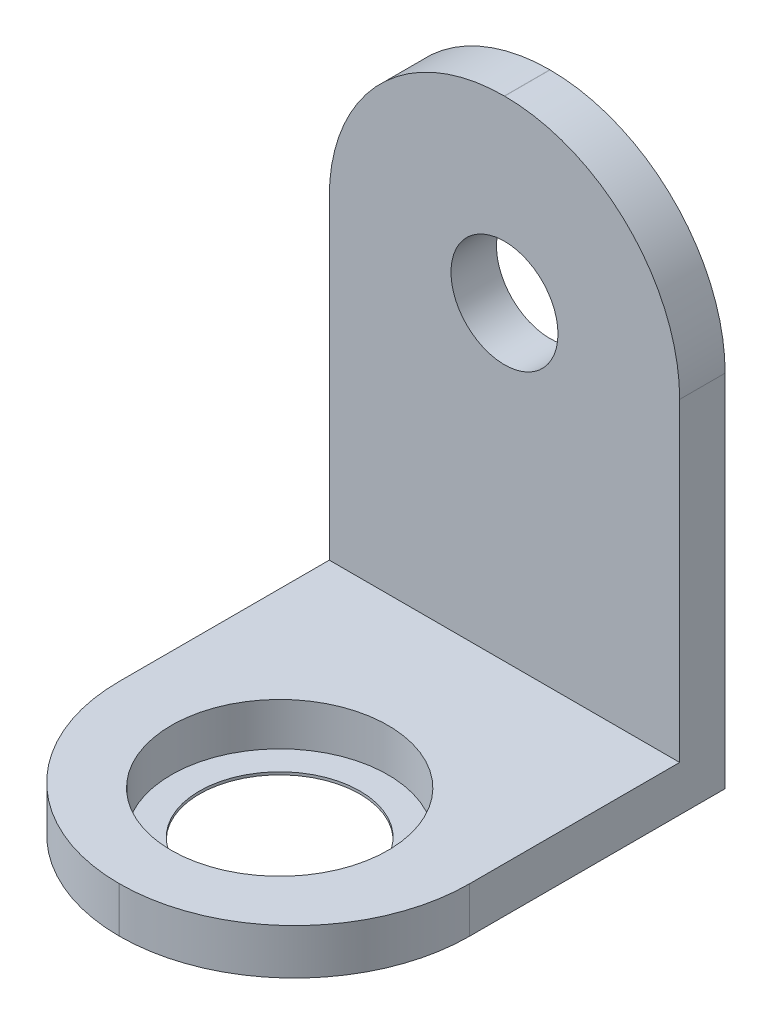
ISO-10303-21;
HEADER;
FILE_DESCRIPTION(('STEP AP214'),'2;1');
FILE_NAME('part.step','',(''),(''),'','','');
FILE_SCHEMA(('AUTOMOTIVE_DESIGN { 1 0 10303 214 1 1 1 1 }'));
ENDSEC;
DATA;
#1=APPLICATION_CONTEXT('core data for automotive mechanical design processes');
#2=APPLICATION_PROTOCOL_DEFINITION('international standard','automotive_design',2000,#1);
#3=PRODUCT_CONTEXT('',#1,'mechanical');
#4=PRODUCT('Part','Part','',(#3));
#5=PRODUCT_RELATED_PRODUCT_CATEGORY('part','',(#4));
#6=PRODUCT_DEFINITION_FORMATION('','',#4);
#7=PRODUCT_DEFINITION_CONTEXT('part definition',#1,'design');
#8=PRODUCT_DEFINITION('design','',#6,#7);
#9=PRODUCT_DEFINITION_SHAPE('','',#8);
#10=(LENGTH_UNIT() NAMED_UNIT(*) SI_UNIT(.MILLI.,.METRE.));
#11=(NAMED_UNIT(*) PLANE_ANGLE_UNIT() SI_UNIT($,.RADIAN.));
#12=(NAMED_UNIT(*) SI_UNIT($,.STERADIAN.) SOLID_ANGLE_UNIT());
#13=UNCERTAINTY_MEASURE_WITH_UNIT(LENGTH_MEASURE(1.E-05),#10,'distance_accuracy_value','');
#14=(GEOMETRIC_REPRESENTATION_CONTEXT(3) GLOBAL_UNCERTAINTY_ASSIGNED_CONTEXT((#13)) GLOBAL_UNIT_ASSIGNED_CONTEXT((#10,
#11,#12)) REPRESENTATION_CONTEXT('',''));
#15=CARTESIAN_POINT('',(0.,0.,0.));
#16=DIRECTION('',(0.,0.,1.));
#17=DIRECTION('',(1.,0.,0.));
#18=AXIS2_PLACEMENT_3D('',#15,#16,#17);
#19=CARTESIAN_POINT('',(0.0989682539682306,1.7,-0.445000000000001));
#20=DIRECTION('',(0.,-1.,0.));
#21=DIRECTION('',(0.,0.,-1.));
#22=AXIS2_PLACEMENT_3D('',#19,#20,#21);
#23=PLANE('',#22);
#24=CARTESIAN_POINT('',(0.,1.7,0.));
#25=DIRECTION('',(0.,1.,0.));
#26=DIRECTION('',(0.,0.,1.));
#27=AXIS2_PLACEMENT_3D('',#24,#25,#26);
#28=CIRCLE('',#27,4.05);
#29=CARTESIAN_POINT('',(0.,1.7,4.05));
#30=VERTEX_POINT('',#29);
#31=EDGE_CURVE('E279',#30,#30,#28,.T.);
#32=ORIENTED_EDGE('',*,*,#31,.F.);
#33=EDGE_LOOP('',(#32));
#34=FACE_BOUND('',#33,.T.);
#35=DIRECTION('',(1.,0.,0.));
#36=VECTOR('',#35,1.);
#37=CARTESIAN_POINT('',(-6.44603174603177,1.7,-8.3));
#38=LINE('',#37,#36);
#39=CARTESIAN_POINT('',(-6.44603174603177,1.7,-8.3));
#40=VERTEX_POINT('',#39);
#41=CARTESIAN_POINT('',(6.65396825396823,1.7,-8.3));
#42=VERTEX_POINT('',#41);
#43=EDGE_CURVE('E120',#40,#42,#38,.T.);
#44=ORIENTED_EDGE('',*,*,#43,.F.);
#45=DIRECTION('',(0.,0.,1.));
#46=VECTOR('',#45,1.);
#47=CARTESIAN_POINT('',(-6.44603174603177,1.7,-10.));
#48=LINE('',#47,#46);
#49=CARTESIAN_POINT('',(-6.44603174603177,1.7,-0.445000000000046));
#50=VERTEX_POINT('',#49);
#51=EDGE_CURVE('E140',#40,#50,#48,.T.);
#52=ORIENTED_EDGE('',*,*,#51,.T.);
#53=CARTESIAN_POINT('',(0.0989682539682306,1.7,-0.445000000000001));
#54=DIRECTION('',(0.,1.,0.));
#55=DIRECTION('',(0.,0.,-1.));
#56=AXIS2_PLACEMENT_3D('',#53,#54,#55);
#57=CIRCLE('',#56,6.545);
#58=CARTESIAN_POINT('',(0.0989682539682757,1.7,6.1));
#59=VERTEX_POINT('',#58);
#60=EDGE_CURVE('E142',#50,#59,#57,.T.);
#61=ORIENTED_EDGE('',*,*,#60,.T.);
#62=DIRECTION('',(1.,0.,0.));
#63=VECTOR('',#62,1.);
#64=CARTESIAN_POINT('',(0.0989682539682757,1.7,6.1));
#65=LINE('',#64,#63);
#66=CARTESIAN_POINT('',(0.108968253968186,1.7,6.1));
#67=VERTEX_POINT('',#66);
#68=EDGE_CURVE('E145',#59,#67,#65,.T.);
#69=ORIENTED_EDGE('',*,*,#68,.T.);
#70=CARTESIAN_POINT('',(0.108968253968232,1.7,-0.444999999999999));
#71=DIRECTION('',(0.,1.,0.));
#72=DIRECTION('',(0.,0.,-1.));
#73=AXIS2_PLACEMENT_3D('',#70,#71,#72);
#74=CIRCLE('',#73,6.545);
#75=CARTESIAN_POINT('',(6.65396825396823,1.7,-0.445000000000048));
#76=VERTEX_POINT('',#75);
#77=EDGE_CURVE('E123',#67,#76,#74,.T.);
#78=ORIENTED_EDGE('',*,*,#77,.T.);
#79=DIRECTION('',(0.,0.,-1.));
#80=VECTOR('',#79,1.);
#81=CARTESIAN_POINT('',(6.65396825396823,1.7,-10.));
#82=LINE('',#81,#80);
#83=EDGE_CURVE('E112',#76,#42,#82,.T.);
#84=ORIENTED_EDGE('',*,*,#83,.T.);
#85=EDGE_LOOP('',(#44,#52,#61,#69,#78,#84));
#86=FACE_BOUND('',#85,.T.);
#87=ADVANCED_FACE('F32',(#34,#86),#23,.F.);
#88=CARTESIAN_POINT('',(0.0989682539682306,0.,-0.445000000000001));
#89=DIRECTION('',(0.,-1.,0.));
#90=DIRECTION('',(0.,0.,-1.));
#91=AXIS2_PLACEMENT_3D('',#88,#89,#90);
#92=PLANE('',#91);
#93=CARTESIAN_POINT('',(0.,0.,0.));
#94=DIRECTION('',(0.,-1.,0.));
#95=DIRECTION('',(0.,0.,-1.));
#96=AXIS2_PLACEMENT_3D('',#93,#94,#95);
#97=CIRCLE('',#96,3.);
#98=CARTESIAN_POINT('',(0.,0.,-3.));
#99=VERTEX_POINT('',#98);
#100=EDGE_CURVE('E277',#99,#99,#97,.T.);
#101=ORIENTED_EDGE('',*,*,#100,.F.);
#102=EDGE_LOOP('',(#101));
#103=FACE_BOUND('',#102,.T.);
#104=DIRECTION('',(0.,0.,1.));
#105=VECTOR('',#104,1.);
#106=CARTESIAN_POINT('',(-6.44603174603177,0.,-10.));
#107=LINE('',#106,#105);
#108=CARTESIAN_POINT('',(-6.44603174603177,0.,-10.));
#109=VERTEX_POINT('',#108);
#110=CARTESIAN_POINT('',(-6.44603174603177,0.,-0.445000000000046));
#111=VERTEX_POINT('',#110);
#112=EDGE_CURVE('E139',#109,#111,#107,.T.);
#113=ORIENTED_EDGE('',*,*,#112,.F.);
#114=DIRECTION('',(-1.,0.,0.));
#115=VECTOR('',#114,1.);
#116=CARTESIAN_POINT('',(-6.44603174603177,0.,-10.));
#117=LINE('',#116,#115);
#118=CARTESIAN_POINT('',(6.65396825396823,0.,-10.));
#119=VERTEX_POINT('',#118);
#120=EDGE_CURVE('E143',#119,#109,#117,.T.);
#121=ORIENTED_EDGE('',*,*,#120,.F.);
#122=DIRECTION('',(0.,0.,-1.));
#123=VECTOR('',#122,1.);
#124=CARTESIAN_POINT('',(6.65396825396823,0.,-10.));
#125=LINE('',#124,#123);
#126=CARTESIAN_POINT('',(6.65396825396823,0.,-0.445000000000048));
#127=VERTEX_POINT('',#126);
#128=EDGE_CURVE('E156',#127,#119,#125,.T.);
#129=ORIENTED_EDGE('',*,*,#128,.F.);
#130=CARTESIAN_POINT('',(0.108968253968232,0.,-0.444999999999999));
#131=DIRECTION('',(0.,1.,0.));
#132=DIRECTION('',(0.,0.,-1.));
#133=AXIS2_PLACEMENT_3D('',#130,#131,#132);
#134=CIRCLE('',#133,6.545);
#135=CARTESIAN_POINT('',(0.108968253968186,0.,6.1));
#136=VERTEX_POINT('',#135);
#137=EDGE_CURVE('E154',#136,#127,#134,.T.);
#138=ORIENTED_EDGE('',*,*,#137,.F.);
#139=DIRECTION('',(1.,0.,0.));
#140=VECTOR('',#139,1.);
#141=CARTESIAN_POINT('',(0.0989682539682757,0.,6.1));
#142=LINE('',#141,#140);
#143=CARTESIAN_POINT('',(0.0989682539682757,0.,6.1));
#144=VERTEX_POINT('',#143);
#145=EDGE_CURVE('E152',#144,#136,#142,.T.);
#146=ORIENTED_EDGE('',*,*,#145,.F.);
#147=CARTESIAN_POINT('',(0.0989682539682306,0.,-0.445000000000001));
#148=DIRECTION('',(0.,1.,0.));
#149=DIRECTION('',(0.,0.,-1.));
#150=AXIS2_PLACEMENT_3D('',#147,#148,#149);
#151=CIRCLE('',#150,6.545);
#152=EDGE_CURVE('E150',#111,#144,#151,.T.);
#153=ORIENTED_EDGE('',*,*,#152,.F.);
#154=EDGE_LOOP('',(#113,#121,#129,#138,#146,#153));
#155=FACE_BOUND('',#154,.T.);
#156=ADVANCED_FACE('F202',(#103,#155),#92,.T.);
#157=CARTESIAN_POINT('',(-6.44603174603177,1.7,-10.));
#158=DIRECTION('',(1.,0.,0.));
#159=DIRECTION('',(0.,0.,-1.));
#160=AXIS2_PLACEMENT_3D('',#157,#158,#159);
#161=PLANE('',#160);
#162=DIRECTION('',(0.,-1.,0.));
#163=VECTOR('',#162,1.);
#164=CARTESIAN_POINT('',(-6.44603174603177,20.,-8.3));
#165=LINE('',#164,#163);
#166=CARTESIAN_POINT('',(-6.44603174603177,13.455,-8.3));
#167=VERTEX_POINT('',#166);
#168=EDGE_CURVE('E115',#167,#40,#165,.T.);
#169=ORIENTED_EDGE('',*,*,#168,.F.);
#170=DIRECTION('',(0.,0.,1.));
#171=VECTOR('',#170,1.);
#172=CARTESIAN_POINT('',(-6.44603174603177,13.455,-10.));
#173=LINE('',#172,#171);
#174=CARTESIAN_POINT('',(-6.44603174603177,13.455,-10.));
#175=VERTEX_POINT('',#174);
#176=EDGE_CURVE('E11',#167,#175,#173,.F.);
#177=ORIENTED_EDGE('',*,*,#176,.T.);
#178=DIRECTION('',(0.,-1.,0.));
#179=VECTOR('',#178,1.);
#180=CARTESIAN_POINT('',(-6.44603174603177,1.7,-10.));
#181=LINE('',#180,#179);
#182=EDGE_CURVE('E125',#175,#109,#181,.T.);
#183=ORIENTED_EDGE('',*,*,#182,.T.);
#184=ORIENTED_EDGE('',*,*,#112,.T.);
#185=DIRECTION('',(0.,-1.,0.));
#186=VECTOR('',#185,1.);
#187=CARTESIAN_POINT('',(-6.44603174603177,1.7,-0.445000000000046));
#188=LINE('',#187,#186);
#189=EDGE_CURVE('E172',#50,#111,#188,.T.);
#190=ORIENTED_EDGE('',*,*,#189,.F.);
#191=ORIENTED_EDGE('',*,*,#51,.F.);
#192=EDGE_LOOP('',(#169,#177,#183,#184,#190,#191));
#193=FACE_BOUND('',#192,.T.);
#194=ADVANCED_FACE('F208',(#193),#161,.F.);
#195=CARTESIAN_POINT('',(0.0989682539682306,1.7,-0.445000000000001));
#196=DIRECTION('',(0.,-1.,0.));
#197=DIRECTION('',(0.,0.,-1.));
#198=AXIS2_PLACEMENT_3D('',#195,#196,#197);
#199=CYLINDRICAL_SURFACE('',#198,6.545);
#200=ORIENTED_EDGE('',*,*,#152,.T.);
#201=DIRECTION('',(0.,-1.,0.));
#202=VECTOR('',#201,1.);
#203=CARTESIAN_POINT('',(0.0989682539682757,1.7,6.1));
#204=LINE('',#203,#202);
#205=EDGE_CURVE('E169',#59,#144,#204,.T.);
#206=ORIENTED_EDGE('',*,*,#205,.F.);
#207=ORIENTED_EDGE('',*,*,#60,.F.);
#208=ORIENTED_EDGE('',*,*,#189,.T.);
#209=EDGE_LOOP('',(#200,#206,#207,#208));
#210=FACE_BOUND('',#209,.T.);
#211=ADVANCED_FACE('F213',(#210),#199,.T.);
#212=CARTESIAN_POINT('',(0.0989682539682757,1.7,6.1));
#213=DIRECTION('',(0.,0.,-1.));
#214=DIRECTION('',(-1.,0.,0.));
#215=AXIS2_PLACEMENT_3D('',#212,#213,#214);
#216=PLANE('',#215);
#217=ORIENTED_EDGE('',*,*,#145,.T.);
#218=DIRECTION('',(0.,-1.,0.));
#219=VECTOR('',#218,1.);
#220=CARTESIAN_POINT('',(0.108968253968186,1.7,6.1));
#221=LINE('',#220,#219);
#222=EDGE_CURVE('E166',#67,#136,#221,.T.);
#223=ORIENTED_EDGE('',*,*,#222,.F.);
#224=ORIENTED_EDGE('',*,*,#68,.F.);
#225=ORIENTED_EDGE('',*,*,#205,.T.);
#226=EDGE_LOOP('',(#217,#223,#224,#225));
#227=FACE_BOUND('',#226,.T.);
#228=ADVANCED_FACE('F218',(#227),#216,.F.);
#229=CARTESIAN_POINT('',(0.108968253968232,1.7,-0.444999999999999));
#230=DIRECTION('',(0.,-1.,0.));
#231=DIRECTION('',(0.,0.,-1.));
#232=AXIS2_PLACEMENT_3D('',#229,#230,#231);
#233=CYLINDRICAL_SURFACE('',#232,6.545);
#234=ORIENTED_EDGE('',*,*,#137,.T.);
#235=DIRECTION('',(0.,-1.,0.));
#236=VECTOR('',#235,1.);
#237=CARTESIAN_POINT('',(6.65396825396823,1.7,-0.445000000000048));
#238=LINE('',#237,#236);
#239=EDGE_CURVE('E164',#76,#127,#238,.T.);
#240=ORIENTED_EDGE('',*,*,#239,.F.);
#241=ORIENTED_EDGE('',*,*,#77,.F.);
#242=ORIENTED_EDGE('',*,*,#222,.T.);
#243=EDGE_LOOP('',(#234,#240,#241,#242));
#244=FACE_BOUND('',#243,.T.);
#245=ADVANCED_FACE('F220',(#244),#233,.T.);
#246=CARTESIAN_POINT('',(6.65396825396823,1.7,-10.));
#247=DIRECTION('',(-1.,0.,0.));
#248=DIRECTION('',(0.,0.,1.));
#249=AXIS2_PLACEMENT_3D('',#246,#247,#248);
#250=PLANE('',#249);
#251=DIRECTION('',(0.,-1.,0.));
#252=VECTOR('',#251,1.);
#253=CARTESIAN_POINT('',(6.65396825396823,1.7,-10.));
#254=LINE('',#253,#252);
#255=CARTESIAN_POINT('',(6.65396825396823,13.455,-10.));
#256=VERTEX_POINT('',#255);
#257=EDGE_CURVE('E162',#256,#119,#254,.T.);
#258=ORIENTED_EDGE('',*,*,#257,.F.);
#259=DIRECTION('',(0.,0.,-1.));
#260=VECTOR('',#259,1.);
#261=CARTESIAN_POINT('',(6.65396825396823,13.455,-8.3));
#262=LINE('',#261,#260);
#263=CARTESIAN_POINT('',(6.65396825396823,13.455,-8.3));
#264=VERTEX_POINT('',#263);
#265=EDGE_CURVE('E56',#256,#264,#262,.F.);
#266=ORIENTED_EDGE('',*,*,#265,.T.);
#267=DIRECTION('',(0.,-1.,0.));
#268=VECTOR('',#267,1.);
#269=CARTESIAN_POINT('',(6.65396825396823,20.,-8.3));
#270=LINE('',#269,#268);
#271=EDGE_CURVE('E108',#264,#42,#270,.T.);
#272=ORIENTED_EDGE('',*,*,#271,.T.);
#273=ORIENTED_EDGE('',*,*,#83,.F.);
#274=ORIENTED_EDGE('',*,*,#239,.T.);
#275=ORIENTED_EDGE('',*,*,#128,.T.);
#276=EDGE_LOOP('',(#258,#266,#272,#273,#274,#275));
#277=FACE_BOUND('',#276,.T.);
#278=ADVANCED_FACE('F110',(#277),#250,.F.);
#279=CARTESIAN_POINT('',(-6.44603174603177,1.7,-10.));
#280=DIRECTION('',(0.,0.,1.));
#281=DIRECTION('',(1.,0.,0.));
#282=AXIS2_PLACEMENT_3D('',#279,#280,#281);
#283=PLANE('',#282);
#284=CARTESIAN_POINT('',(0.103968253968231,13.3,-10.));
#285=DIRECTION('',(0.,0.,1.));
#286=DIRECTION('',(1.,0.,0.));
#287=AXIS2_PLACEMENT_3D('',#284,#285,#286);
#288=CIRCLE('',#287,2.);
#289=CARTESIAN_POINT('',(2.10396825396823,13.3,-10.));
#290=VERTEX_POINT('',#289);
#291=EDGE_CURVE('E129',#290,#290,#288,.T.);
#292=ORIENTED_EDGE('',*,*,#291,.T.);
#293=EDGE_LOOP('',(#292));
#294=FACE_BOUND('',#293,.T.);
#295=DIRECTION('',(-1.,0.,0.));
#296=VECTOR('',#295,1.);
#297=CARTESIAN_POINT('',(-6.44603174603177,20.,-10.));
#298=LINE('',#297,#296);
#299=CARTESIAN_POINT('',(0.108968253968228,20.,-10.));
#300=VERTEX_POINT('',#299);
#301=CARTESIAN_POINT('',(0.0989682539682271,20.,-10.));
#302=VERTEX_POINT('',#301);
#303=EDGE_CURVE('E116',#300,#302,#298,.T.);
#304=ORIENTED_EDGE('',*,*,#303,.F.);
#305=CARTESIAN_POINT('',(0.108968253968229,13.455,-10.));
#306=DIRECTION('',(0.,0.,1.));
#307=DIRECTION('',(1.,0.,0.));
#308=AXIS2_PLACEMENT_3D('',#305,#306,#307);
#309=CIRCLE('',#308,6.545);
#310=EDGE_CURVE('E183',#300,#256,#309,.F.);
#311=ORIENTED_EDGE('',*,*,#310,.T.);
#312=ORIENTED_EDGE('',*,*,#257,.T.);
#313=ORIENTED_EDGE('',*,*,#120,.T.);
#314=ORIENTED_EDGE('',*,*,#182,.F.);
#315=CARTESIAN_POINT('',(0.0989682539682289,13.455,-10.));
#316=DIRECTION('',(0.,0.,1.));
#317=DIRECTION('',(1.,0.,0.));
#318=AXIS2_PLACEMENT_3D('',#315,#316,#317);
#319=CIRCLE('',#318,6.545);
#320=EDGE_CURVE('E181',#175,#302,#319,.F.);
#321=ORIENTED_EDGE('',*,*,#320,.T.);
#322=EDGE_LOOP('',(#304,#311,#312,#313,#314,#321));
#323=FACE_BOUND('',#322,.T.);
#324=ADVANCED_FACE('F196',(#294,#323),#283,.F.);
#325=CARTESIAN_POINT('',(-6.44603174603177,20.,-8.3));
#326=DIRECTION('',(0.,0.,-1.));
#327=DIRECTION('',(-1.,0.,0.));
#328=AXIS2_PLACEMENT_3D('',#325,#326,#327);
#329=PLANE('',#328);
#330=CARTESIAN_POINT('',(0.103968253968231,13.3,-8.3));
#331=DIRECTION('',(0.,0.,1.));
#332=DIRECTION('',(1.,0.,0.));
#333=AXIS2_PLACEMENT_3D('',#330,#331,#332);
#334=CIRCLE('',#333,2.);
#335=CARTESIAN_POINT('',(2.10396825396823,13.3,-8.3));
#336=VERTEX_POINT('',#335);
#337=EDGE_CURVE('E134',#336,#336,#334,.T.);
#338=ORIENTED_EDGE('',*,*,#337,.F.);
#339=EDGE_LOOP('',(#338));
#340=FACE_BOUND('',#339,.T.);
#341=ORIENTED_EDGE('',*,*,#271,.F.);
#342=CARTESIAN_POINT('',(0.10896825396823,13.455,-8.3));
#343=DIRECTION('',(0.,0.,-1.));
#344=DIRECTION('',(-1.,0.,0.));
#345=AXIS2_PLACEMENT_3D('',#342,#343,#344);
#346=CIRCLE('',#345,6.545);
#347=CARTESIAN_POINT('',(0.108968253968228,20.,-8.3));
#348=VERTEX_POINT('',#347);
#349=EDGE_CURVE('E41',#264,#348,#346,.F.);
#350=ORIENTED_EDGE('',*,*,#349,.T.);
#351=DIRECTION('',(1.,0.,0.));
#352=VECTOR('',#351,1.);
#353=CARTESIAN_POINT('',(-6.44603174603177,20.,-8.3));
#354=LINE('',#353,#352);
#355=CARTESIAN_POINT('',(0.0989682539682271,20.,-8.3));
#356=VERTEX_POINT('',#355);
#357=EDGE_CURVE('E128',#356,#348,#354,.T.);
#358=ORIENTED_EDGE('',*,*,#357,.F.);
#359=CARTESIAN_POINT('',(0.0989682539682292,13.455,-8.3));
#360=DIRECTION('',(0.,0.,-1.));
#361=DIRECTION('',(-1.,0.,0.));
#362=AXIS2_PLACEMENT_3D('',#359,#360,#361);
#363=CIRCLE('',#362,6.545);
#364=EDGE_CURVE('E48',#356,#167,#363,.F.);
#365=ORIENTED_EDGE('',*,*,#364,.T.);
#366=ORIENTED_EDGE('',*,*,#168,.T.);
#367=ORIENTED_EDGE('',*,*,#43,.T.);
#368=EDGE_LOOP('',(#341,#350,#358,#365,#366,#367));
#369=FACE_BOUND('',#368,.T.);
#370=ADVANCED_FACE('F127',(#340,#369),#329,.F.);
#371=CARTESIAN_POINT('',(0.,20.,0.));
#372=DIRECTION('',(0.,1.,0.));
#373=DIRECTION('',(0.,0.,1.));
#374=AXIS2_PLACEMENT_3D('',#371,#372,#373);
#375=PLANE('',#374);
#376=ORIENTED_EDGE('',*,*,#357,.T.);
#377=DIRECTION('',(0.,0.,-1.));
#378=VECTOR('',#377,1.);
#379=CARTESIAN_POINT('',(0.108968253968229,20.,-10.));
#380=LINE('',#379,#378);
#381=EDGE_CURVE('E178',#348,#300,#380,.T.);
#382=ORIENTED_EDGE('',*,*,#381,.T.);
#383=ORIENTED_EDGE('',*,*,#303,.T.);
#384=DIRECTION('',(0.,0.,1.));
#385=VECTOR('',#384,1.);
#386=CARTESIAN_POINT('',(0.0989682539682292,20.,-8.3));
#387=LINE('',#386,#385);
#388=EDGE_CURVE('E175',#302,#356,#387,.T.);
#389=ORIENTED_EDGE('',*,*,#388,.T.);
#390=EDGE_LOOP('',(#376,#382,#383,#389));
#391=FACE_BOUND('',#390,.T.);
#392=ADVANCED_FACE('F190',(#391),#375,.T.);
#393=CARTESIAN_POINT('',(0.103968253968231,13.3,-26.6));
#394=DIRECTION('',(0.,0.,1.));
#395=DIRECTION('',(1.,0.,0.));
#396=AXIS2_PLACEMENT_3D('',#393,#394,#395);
#397=CYLINDRICAL_SURFACE('',#396,2.);
#398=ORIENTED_EDGE('',*,*,#337,.T.);
#399=EDGE_LOOP('',(#398));
#400=FACE_BOUND('',#399,.T.);
#401=ORIENTED_EDGE('',*,*,#291,.F.);
#402=EDGE_LOOP('',(#401));
#403=FACE_BOUND('',#402,.T.);
#404=ADVANCED_FACE('F249',(#400,#403),#397,.F.);
#405=CARTESIAN_POINT('',(0.108968253968231,13.455,0.));
#406=DIRECTION('',(0.,0.,1.));
#407=DIRECTION('',(1.,0.,0.));
#408=AXIS2_PLACEMENT_3D('',#405,#406,#407);
#409=CYLINDRICAL_SURFACE('',#408,6.545);
#410=ORIENTED_EDGE('',*,*,#349,.F.);
#411=ORIENTED_EDGE('',*,*,#265,.F.);
#412=ORIENTED_EDGE('',*,*,#310,.F.);
#413=ORIENTED_EDGE('',*,*,#381,.F.);
#414=EDGE_LOOP('',(#410,#411,#412,#413));
#415=FACE_BOUND('',#414,.T.);
#416=ADVANCED_FACE('F194',(#415),#409,.T.);
#417=CARTESIAN_POINT('',(0.0989682539682307,13.455,0.));
#418=DIRECTION('',(0.,0.,-1.));
#419=DIRECTION('',(-1.,0.,0.));
#420=AXIS2_PLACEMENT_3D('',#417,#418,#419);
#421=CYLINDRICAL_SURFACE('',#420,6.545);
#422=ORIENTED_EDGE('',*,*,#320,.F.);
#423=ORIENTED_EDGE('',*,*,#176,.F.);
#424=ORIENTED_EDGE('',*,*,#364,.F.);
#425=ORIENTED_EDGE('',*,*,#388,.F.);
#426=EDGE_LOOP('',(#422,#423,#424,#425));
#427=FACE_BOUND('',#426,.T.);
#428=ADVANCED_FACE('F34',(#427),#421,.T.);
#429=CARTESIAN_POINT('',(0.,0.0999999999999998,0.));
#430=DIRECTION('',(0.,1.,0.));
#431=DIRECTION('',(0.,0.,1.));
#432=AXIS2_PLACEMENT_3D('',#429,#430,#431);
#433=CYLINDRICAL_SURFACE('',#432,4.05);
#434=CARTESIAN_POINT('',(0.,0.0999999999999998,0.));
#435=DIRECTION('',(0.,1.,0.));
#436=DIRECTION('',(0.,0.,1.));
#437=AXIS2_PLACEMENT_3D('',#434,#435,#436);
#438=CIRCLE('',#437,4.05);
#439=CARTESIAN_POINT('',(0.,0.0999999999999998,4.05));
#440=VERTEX_POINT('',#439);
#441=EDGE_CURVE('E281',#440,#440,#438,.T.);
#442=ORIENTED_EDGE('',*,*,#441,.F.);
#443=EDGE_LOOP('',(#442));
#444=FACE_BOUND('',#443,.T.);
#445=ORIENTED_EDGE('',*,*,#31,.T.);
#446=EDGE_LOOP('',(#445));
#447=FACE_BOUND('',#446,.T.);
#448=ADVANCED_FACE('F259',(#444,#447),#433,.F.);
#449=CARTESIAN_POINT('',(0.,0.0999999999999998,0.));
#450=DIRECTION('',(0.,1.,0.));
#451=DIRECTION('',(0.,0.,1.));
#452=AXIS2_PLACEMENT_3D('',#449,#450,#451);
#453=PLANE('',#452);
#454=CARTESIAN_POINT('',(0.,0.0999999999999998,0.));
#455=DIRECTION('',(0.,1.,0.));
#456=DIRECTION('',(0.,0.,1.));
#457=AXIS2_PLACEMENT_3D('',#454,#455,#456);
#458=CIRCLE('',#457,3.);
#459=CARTESIAN_POINT('',(0.,0.0999999999999998,3.));
#460=VERTEX_POINT('',#459);
#461=EDGE_CURVE('E36',#460,#460,#458,.T.);
#462=ORIENTED_EDGE('',*,*,#461,.F.);
#463=EDGE_LOOP('',(#462));
#464=FACE_BOUND('',#463,.T.);
#465=ORIENTED_EDGE('',*,*,#441,.T.);
#466=EDGE_LOOP('',(#465));
#467=FACE_BOUND('',#466,.T.);
#468=ADVANCED_FACE('F262',(#464,#467),#453,.T.);
#469=CARTESIAN_POINT('',(0.,2.,0.));
#470=DIRECTION('',(0.,-1.,0.));
#471=DIRECTION('',(0.,0.,-1.));
#472=AXIS2_PLACEMENT_3D('',#469,#470,#471);
#473=CYLINDRICAL_SURFACE('',#472,3.);
#474=ORIENTED_EDGE('',*,*,#461,.T.);
#475=EDGE_LOOP('',(#474));
#476=FACE_BOUND('',#475,.T.);
#477=ORIENTED_EDGE('',*,*,#100,.T.);
#478=EDGE_LOOP('',(#477));
#479=FACE_BOUND('',#478,.T.);
#480=ADVANCED_FACE('F266',(#476,#479),#473,.F.);
#481=CLOSED_SHELL('',(#87,#156,#194,#211,#228,#245,#278,#324,#370,#392,#404,#416,#428,#448,#468,#480));
#482=MANIFOLD_SOLID_BREP('B2',#481);
#483=ADVANCED_BREP_SHAPE_REPRESENTATION('',(#18,#482),#14);
#484=SHAPE_DEFINITION_REPRESENTATION(#9,#483);
ENDSEC;
END-ISO-10303-21;
